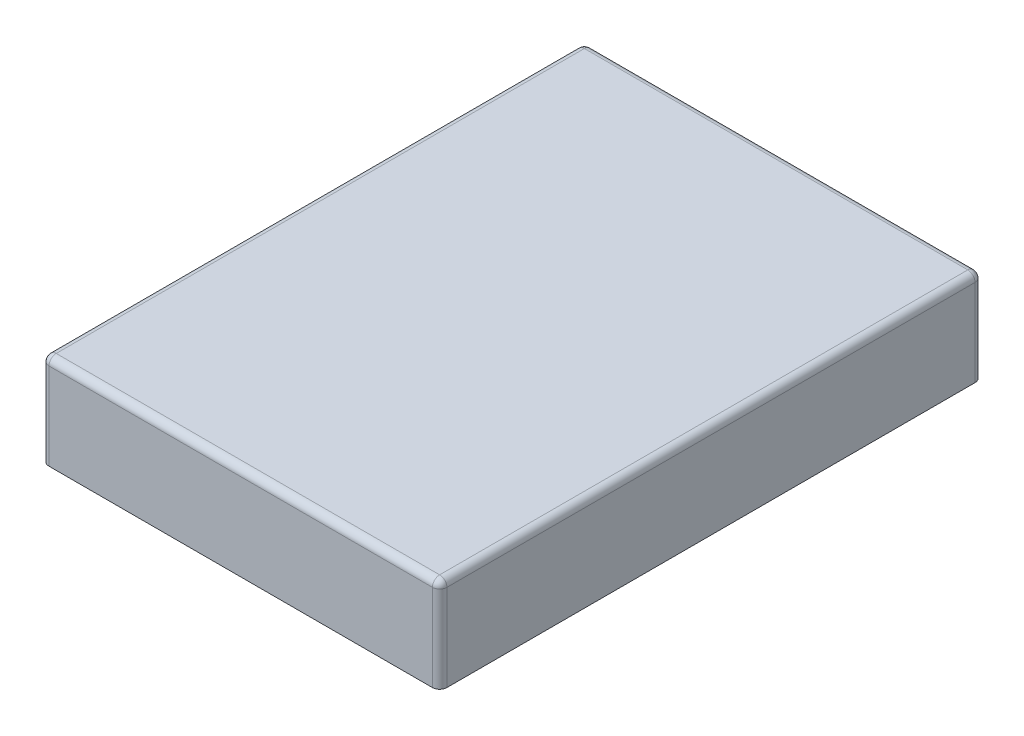
ISO-10303-21;
HEADER;
FILE_DESCRIPTION(('STEP AP214'),'2;1');
FILE_NAME('part.step','',(''),(''),'','','');
FILE_SCHEMA(('AUTOMOTIVE_DESIGN { 1 0 10303 214 1 1 1 1 }'));
ENDSEC;
DATA;
#1=APPLICATION_CONTEXT('core data for automotive mechanical design processes');
#2=APPLICATION_PROTOCOL_DEFINITION('international standard','automotive_design',2000,#1);
#3=PRODUCT_CONTEXT('',#1,'mechanical');
#4=PRODUCT('Part','Part','',(#3));
#5=PRODUCT_RELATED_PRODUCT_CATEGORY('part','',(#4));
#6=PRODUCT_DEFINITION_FORMATION('','',#4);
#7=PRODUCT_DEFINITION_CONTEXT('part definition',#1,'design');
#8=PRODUCT_DEFINITION('design','',#6,#7);
#9=PRODUCT_DEFINITION_SHAPE('','',#8);
#10=(LENGTH_UNIT() NAMED_UNIT(*) SI_UNIT(.MILLI.,.METRE.));
#11=(NAMED_UNIT(*) PLANE_ANGLE_UNIT() SI_UNIT($,.RADIAN.));
#12=(NAMED_UNIT(*) SI_UNIT($,.STERADIAN.) SOLID_ANGLE_UNIT());
#13=UNCERTAINTY_MEASURE_WITH_UNIT(LENGTH_MEASURE(1.E-05),#10,'distance_accuracy_value','');
#14=(GEOMETRIC_REPRESENTATION_CONTEXT(3) GLOBAL_UNCERTAINTY_ASSIGNED_CONTEXT((#13)) GLOBAL_UNIT_ASSIGNED_CONTEXT((#10,
#11,#12)) REPRESENTATION_CONTEXT('',''));
#15=CARTESIAN_POINT('',(0.,0.,0.));
#16=DIRECTION('',(0.,0.,1.));
#17=DIRECTION('',(1.,0.,0.));
#18=AXIS2_PLACEMENT_3D('',#15,#16,#17);
#19=CARTESIAN_POINT('',(27.5,13.,37.5));
#20=DIRECTION('',(-1.,0.,0.));
#21=DIRECTION('',(0.,0.,1.));
#22=AXIS2_PLACEMENT_3D('',#19,#20,#21);
#23=PLANE('',#22);
#24=DIRECTION('',(0.,0.,-1.));
#25=VECTOR('',#24,1.);
#26=CARTESIAN_POINT('',(27.5,0.,37.5));
#27=LINE('',#26,#25);
#28=CARTESIAN_POINT('',(27.5,0.,36.5));
#29=VERTEX_POINT('',#28);
#30=CARTESIAN_POINT('',(27.5,0.,-36.5));
#31=VERTEX_POINT('',#30);
#32=EDGE_CURVE('E209',#29,#31,#27,.T.);
#33=ORIENTED_EDGE('',*,*,#32,.T.);
#34=DIRECTION('',(0.,-1.,0.));
#35=VECTOR('',#34,1.);
#36=CARTESIAN_POINT('',(27.5,13.,-36.5));
#37=LINE('',#36,#35);
#38=CARTESIAN_POINT('',(27.5,12.,-36.5));
#39=VERTEX_POINT('',#38);
#40=EDGE_CURVE('E171',#31,#39,#37,.F.);
#41=ORIENTED_EDGE('',*,*,#40,.T.);
#42=DIRECTION('',(0.,0.,-1.));
#43=VECTOR('',#42,1.);
#44=CARTESIAN_POINT('',(27.5,12.,37.5));
#45=LINE('',#44,#43);
#46=CARTESIAN_POINT('',(27.5,12.,36.5));
#47=VERTEX_POINT('',#46);
#48=EDGE_CURVE('E167',#39,#47,#45,.F.);
#49=ORIENTED_EDGE('',*,*,#48,.T.);
#50=DIRECTION('',(0.,-1.,0.));
#51=VECTOR('',#50,1.);
#52=CARTESIAN_POINT('',(27.5,13.,36.5));
#53=LINE('',#52,#51);
#54=EDGE_CURVE('E169',#47,#29,#53,.T.);
#55=ORIENTED_EDGE('',*,*,#54,.T.);
#56=EDGE_LOOP('',(#33,#41,#49,#55));
#57=FACE_BOUND('',#56,.T.);
#58=ADVANCED_FACE('F39',(#57),#23,.F.);
#59=CARTESIAN_POINT('',(-27.5,13.,-37.5));
#60=DIRECTION('',(0.,0.,1.));
#61=DIRECTION('',(1.,0.,0.));
#62=AXIS2_PLACEMENT_3D('',#59,#60,#61);
#63=PLANE('',#62);
#64=DIRECTION('',(-1.,0.,0.));
#65=VECTOR('',#64,1.);
#66=CARTESIAN_POINT('',(-27.5,0.,-37.5));
#67=LINE('',#66,#65);
#68=CARTESIAN_POINT('',(26.5,0.,-37.5));
#69=VERTEX_POINT('',#68);
#70=CARTESIAN_POINT('',(-26.5,0.,-37.5));
#71=VERTEX_POINT('',#70);
#72=EDGE_CURVE('E148',#69,#71,#67,.T.);
#73=ORIENTED_EDGE('',*,*,#72,.T.);
#74=DIRECTION('',(0.,-1.,0.));
#75=VECTOR('',#74,1.);
#76=CARTESIAN_POINT('',(-26.5,13.,-37.5));
#77=LINE('',#76,#75);
#78=CARTESIAN_POINT('',(-26.5,12.,-37.5));
#79=VERTEX_POINT('',#78);
#80=EDGE_CURVE('E165',#71,#79,#77,.F.);
#81=ORIENTED_EDGE('',*,*,#80,.T.);
#82=DIRECTION('',(-1.,0.,0.));
#83=VECTOR('',#82,1.);
#84=CARTESIAN_POINT('',(-27.5,12.,-37.5));
#85=LINE('',#84,#83);
#86=CARTESIAN_POINT('',(26.5,12.,-37.5));
#87=VERTEX_POINT('',#86);
#88=EDGE_CURVE('E161',#79,#87,#85,.F.);
#89=ORIENTED_EDGE('',*,*,#88,.T.);
#90=DIRECTION('',(0.,-1.,0.));
#91=VECTOR('',#90,1.);
#92=CARTESIAN_POINT('',(26.5,13.,-37.5));
#93=LINE('',#92,#91);
#94=EDGE_CURVE('E163',#87,#69,#93,.T.);
#95=ORIENTED_EDGE('',*,*,#94,.T.);
#96=EDGE_LOOP('',(#73,#81,#89,#95));
#97=FACE_BOUND('',#96,.T.);
#98=ADVANCED_FACE('F221',(#97),#63,.F.);
#99=CARTESIAN_POINT('',(-27.5,13.,37.5));
#100=DIRECTION('',(1.,0.,0.));
#101=DIRECTION('',(0.,0.,-1.));
#102=AXIS2_PLACEMENT_3D('',#99,#100,#101);
#103=PLANE('',#102);
#104=DIRECTION('',(0.,0.,1.));
#105=VECTOR('',#104,1.);
#106=CARTESIAN_POINT('',(-27.5,0.,37.5));
#107=LINE('',#106,#105);
#108=CARTESIAN_POINT('',(-27.5,0.,-36.5));
#109=VERTEX_POINT('',#108);
#110=CARTESIAN_POINT('',(-27.5,0.,36.5));
#111=VERTEX_POINT('',#110);
#112=EDGE_CURVE('E145',#109,#111,#107,.T.);
#113=ORIENTED_EDGE('',*,*,#112,.T.);
#114=DIRECTION('',(0.,-1.,0.));
#115=VECTOR('',#114,1.);
#116=CARTESIAN_POINT('',(-27.5,13.,36.5));
#117=LINE('',#116,#115);
#118=CARTESIAN_POINT('',(-27.5,12.,36.5));
#119=VERTEX_POINT('',#118);
#120=EDGE_CURVE('E124',#111,#119,#117,.F.);
#121=ORIENTED_EDGE('',*,*,#120,.T.);
#122=DIRECTION('',(0.,0.,1.));
#123=VECTOR('',#122,1.);
#124=CARTESIAN_POINT('',(-27.5,12.,37.5));
#125=LINE('',#124,#123);
#126=CARTESIAN_POINT('',(-27.5,12.,-36.5));
#127=VERTEX_POINT('',#126);
#128=EDGE_CURVE('E129',#119,#127,#125,.F.);
#129=ORIENTED_EDGE('',*,*,#128,.T.);
#130=DIRECTION('',(0.,-1.,0.));
#131=VECTOR('',#130,1.);
#132=CARTESIAN_POINT('',(-27.5,13.,-36.5));
#133=LINE('',#132,#131);
#134=EDGE_CURVE('E158',#127,#109,#133,.T.);
#135=ORIENTED_EDGE('',*,*,#134,.T.);
#136=EDGE_LOOP('',(#113,#121,#129,#135));
#137=FACE_BOUND('',#136,.T.);
#138=ADVANCED_FACE('F251',(#137),#103,.F.);
#139=CARTESIAN_POINT('',(-27.5,13.,37.5));
#140=DIRECTION('',(0.,0.,-1.));
#141=DIRECTION('',(-1.,0.,0.));
#142=AXIS2_PLACEMENT_3D('',#139,#140,#141);
#143=PLANE('',#142);
#144=DIRECTION('',(1.,0.,0.));
#145=VECTOR('',#144,1.);
#146=CARTESIAN_POINT('',(-27.5,12.,37.5));
#147=LINE('',#146,#145);
#148=CARTESIAN_POINT('',(26.5,12.,37.5));
#149=VERTEX_POINT('',#148);
#150=CARTESIAN_POINT('',(-26.5,12.,37.5));
#151=VERTEX_POINT('',#150);
#152=EDGE_CURVE('E138',#149,#151,#147,.F.);
#153=ORIENTED_EDGE('',*,*,#152,.T.);
#154=DIRECTION('',(0.,-1.,0.));
#155=VECTOR('',#154,1.);
#156=CARTESIAN_POINT('',(-26.5,13.,37.5));
#157=LINE('',#156,#155);
#158=CARTESIAN_POINT('',(-26.5,0.,37.5));
#159=VERTEX_POINT('',#158);
#160=EDGE_CURVE('E123',#151,#159,#157,.T.);
#161=ORIENTED_EDGE('',*,*,#160,.T.);
#162=DIRECTION('',(1.,0.,0.));
#163=VECTOR('',#162,1.);
#164=CARTESIAN_POINT('',(-27.5,0.,37.5));
#165=LINE('',#164,#163);
#166=CARTESIAN_POINT('',(26.5,0.,37.5));
#167=VERTEX_POINT('',#166);
#168=EDGE_CURVE('E135',#159,#167,#165,.T.);
#169=ORIENTED_EDGE('',*,*,#168,.T.);
#170=DIRECTION('',(0.,-1.,0.));
#171=VECTOR('',#170,1.);
#172=CARTESIAN_POINT('',(26.5,13.,37.5));
#173=LINE('',#172,#171);
#174=EDGE_CURVE('E140',#167,#149,#173,.F.);
#175=ORIENTED_EDGE('',*,*,#174,.T.);
#176=EDGE_LOOP('',(#153,#161,#169,#175));
#177=FACE_BOUND('',#176,.T.);
#178=ADVANCED_FACE('F134',(#177),#143,.F.);
#179=CARTESIAN_POINT('',(0.,13.,0.));
#180=DIRECTION('',(0.,-1.,0.));
#181=DIRECTION('',(0.,0.,-1.));
#182=AXIS2_PLACEMENT_3D('',#179,#180,#181);
#183=PLANE('',#182);
#184=DIRECTION('',(-1.,0.,0.));
#185=VECTOR('',#184,1.);
#186=CARTESIAN_POINT('',(0.,13.,-36.5));
#187=LINE('',#186,#185);
#188=CARTESIAN_POINT('',(26.5,13.,-36.5));
#189=VERTEX_POINT('',#188);
#190=CARTESIAN_POINT('',(-26.5,13.,-36.5));
#191=VERTEX_POINT('',#190);
#192=EDGE_CURVE('E48',#189,#191,#187,.T.);
#193=ORIENTED_EDGE('',*,*,#192,.T.);
#194=DIRECTION('',(0.,0.,1.));
#195=VECTOR('',#194,1.);
#196=CARTESIAN_POINT('',(-26.5,13.,0.));
#197=LINE('',#196,#195);
#198=CARTESIAN_POINT('',(-26.5,13.,36.5));
#199=VERTEX_POINT('',#198);
#200=EDGE_CURVE('E11',#191,#199,#197,.T.);
#201=ORIENTED_EDGE('',*,*,#200,.T.);
#202=DIRECTION('',(1.,0.,0.));
#203=VECTOR('',#202,1.);
#204=CARTESIAN_POINT('',(0.,13.,36.5));
#205=LINE('',#204,#203);
#206=CARTESIAN_POINT('',(26.5,13.,36.5));
#207=VERTEX_POINT('',#206);
#208=EDGE_CURVE('E175',#199,#207,#205,.T.);
#209=ORIENTED_EDGE('',*,*,#208,.T.);
#210=DIRECTION('',(0.,0.,-1.));
#211=VECTOR('',#210,1.);
#212=CARTESIAN_POINT('',(26.5,13.,0.));
#213=LINE('',#212,#211);
#214=EDGE_CURVE('E173',#207,#189,#213,.T.);
#215=ORIENTED_EDGE('',*,*,#214,.T.);
#216=EDGE_LOOP('',(#193,#201,#209,#215));
#217=FACE_BOUND('',#216,.T.);
#218=ADVANCED_FACE('F258',(#217),#183,.F.);
#219=CARTESIAN_POINT('',(0.,0.,0.));
#220=DIRECTION('',(0.,-1.,0.));
#221=DIRECTION('',(0.,0.,-1.));
#222=AXIS2_PLACEMENT_3D('',#219,#220,#221);
#223=PLANE('',#222);
#224=ORIENTED_EDGE('',*,*,#168,.F.);
#225=CARTESIAN_POINT('',(-26.5,0.,36.5));
#226=DIRECTION('',(0.,-1.,0.));
#227=DIRECTION('',(0.,0.,-1.));
#228=AXIS2_PLACEMENT_3D('',#225,#226,#227);
#229=CIRCLE('',#228,1.);
#230=EDGE_CURVE('E119',#159,#111,#229,.T.);
#231=ORIENTED_EDGE('',*,*,#230,.T.);
#232=ORIENTED_EDGE('',*,*,#112,.F.);
#233=CARTESIAN_POINT('',(-26.5,0.,-36.5));
#234=DIRECTION('',(0.,-1.,0.));
#235=DIRECTION('',(0.,0.,-1.));
#236=AXIS2_PLACEMENT_3D('',#233,#234,#235);
#237=CIRCLE('',#236,1.);
#238=EDGE_CURVE('E130',#109,#71,#237,.T.);
#239=ORIENTED_EDGE('',*,*,#238,.T.);
#240=ORIENTED_EDGE('',*,*,#72,.F.);
#241=CARTESIAN_POINT('',(26.5,0.,-36.5));
#242=DIRECTION('',(0.,-1.,0.));
#243=DIRECTION('',(0.,0.,-1.));
#244=AXIS2_PLACEMENT_3D('',#241,#242,#243);
#245=CIRCLE('',#244,1.);
#246=EDGE_CURVE('E154',#69,#31,#245,.T.);
#247=ORIENTED_EDGE('',*,*,#246,.T.);
#248=ORIENTED_EDGE('',*,*,#32,.F.);
#249=CARTESIAN_POINT('',(26.5,0.,36.5));
#250=DIRECTION('',(0.,-1.,0.));
#251=DIRECTION('',(0.,0.,-1.));
#252=AXIS2_PLACEMENT_3D('',#249,#250,#251);
#253=CIRCLE('',#252,1.);
#254=EDGE_CURVE('E139',#29,#167,#253,.T.);
#255=ORIENTED_EDGE('',*,*,#254,.T.);
#256=EDGE_LOOP('',(#224,#231,#232,#239,#240,#247,#248,#255));
#257=FACE_BOUND('',#256,.T.);
#258=ADVANCED_FACE('F142',(#257),#223,.T.);
#259=CARTESIAN_POINT('',(26.5,13.,-36.5));
#260=DIRECTION('',(0.,-1.,0.));
#261=DIRECTION('',(0.,0.,-1.));
#262=AXIS2_PLACEMENT_3D('',#259,#260,#261);
#263=CYLINDRICAL_SURFACE('',#262,1.);
#264=CARTESIAN_POINT('',(26.5,12.,-36.5));
#265=DIRECTION('',(0.,1.,0.));
#266=DIRECTION('',(0.,0.,1.));
#267=AXIS2_PLACEMENT_3D('',#264,#265,#266);
#268=CIRCLE('',#267,1.);
#269=EDGE_CURVE('E43',#39,#87,#268,.T.);
#270=ORIENTED_EDGE('',*,*,#269,.F.);
#271=ORIENTED_EDGE('',*,*,#40,.F.);
#272=ORIENTED_EDGE('',*,*,#246,.F.);
#273=ORIENTED_EDGE('',*,*,#94,.F.);
#274=EDGE_LOOP('',(#270,#271,#272,#273));
#275=FACE_BOUND('',#274,.T.);
#276=ADVANCED_FACE('F41',(#275),#263,.T.);
#277=CARTESIAN_POINT('',(26.5,12.,-36.5));
#278=DIRECTION('',(0.,0.,-1.));
#279=DIRECTION('',(-1.,0.,0.));
#280=AXIS2_PLACEMENT_3D('',#277,#278,#279);
#281=SPHERICAL_SURFACE('',#280,1.);
#282=CARTESIAN_POINT('',(26.5,12.,-36.5));
#283=DIRECTION('',(0.,0.,-1.));
#284=DIRECTION('',(-1.,0.,0.));
#285=AXIS2_PLACEMENT_3D('',#282,#283,#284);
#286=CIRCLE('',#285,1.);
#287=EDGE_CURVE('E201',#39,#189,#286,.F.);
#288=ORIENTED_EDGE('',*,*,#287,.F.);
#289=ORIENTED_EDGE('',*,*,#269,.T.);
#290=CARTESIAN_POINT('',(26.5,12.,-36.5));
#291=DIRECTION('',(1.,0.,0.));
#292=DIRECTION('',(0.,0.,-1.));
#293=AXIS2_PLACEMENT_3D('',#290,#291,#292);
#294=CIRCLE('',#293,1.);
#295=EDGE_CURVE('E203',#189,#87,#294,.F.);
#296=ORIENTED_EDGE('',*,*,#295,.F.);
#297=EDGE_LOOP('',(#288,#289,#296));
#298=FACE_BOUND('',#297,.T.);
#299=ADVANCED_FACE('F287',(#298),#281,.T.);
#300=CARTESIAN_POINT('',(-26.5,13.,-36.5));
#301=DIRECTION('',(0.,-1.,0.));
#302=DIRECTION('',(0.,0.,-1.));
#303=AXIS2_PLACEMENT_3D('',#300,#301,#302);
#304=CYLINDRICAL_SURFACE('',#303,1.);
#305=ORIENTED_EDGE('',*,*,#238,.F.);
#306=ORIENTED_EDGE('',*,*,#134,.F.);
#307=CARTESIAN_POINT('',(-26.5,12.,-36.5));
#308=DIRECTION('',(0.,1.,0.));
#309=DIRECTION('',(0.,0.,1.));
#310=AXIS2_PLACEMENT_3D('',#307,#308,#309);
#311=CIRCLE('',#310,1.);
#312=EDGE_CURVE('E198',#79,#127,#311,.T.);
#313=ORIENTED_EDGE('',*,*,#312,.F.);
#314=ORIENTED_EDGE('',*,*,#80,.F.);
#315=EDGE_LOOP('',(#305,#306,#313,#314));
#316=FACE_BOUND('',#315,.T.);
#317=ADVANCED_FACE('F227',(#316),#304,.T.);
#318=CARTESIAN_POINT('',(0.,12.,-36.5));
#319=DIRECTION('',(-1.,0.,0.));
#320=DIRECTION('',(0.,0.,1.));
#321=AXIS2_PLACEMENT_3D('',#318,#319,#320);
#322=CYLINDRICAL_SURFACE('',#321,1.);
#323=ORIENTED_EDGE('',*,*,#295,.T.);
#324=ORIENTED_EDGE('',*,*,#88,.F.);
#325=CARTESIAN_POINT('',(-26.5,12.,-36.5));
#326=DIRECTION('',(-1.,0.,0.));
#327=DIRECTION('',(0.,0.,1.));
#328=AXIS2_PLACEMENT_3D('',#325,#326,#327);
#329=CIRCLE('',#328,1.);
#330=EDGE_CURVE('E195',#191,#79,#329,.T.);
#331=ORIENTED_EDGE('',*,*,#330,.F.);
#332=ORIENTED_EDGE('',*,*,#192,.F.);
#333=EDGE_LOOP('',(#323,#324,#331,#332));
#334=FACE_BOUND('',#333,.T.);
#335=ADVANCED_FACE('F233',(#334),#322,.T.);
#336=CARTESIAN_POINT('',(26.5,12.,0.));
#337=DIRECTION('',(0.,0.,-1.));
#338=DIRECTION('',(-1.,0.,0.));
#339=AXIS2_PLACEMENT_3D('',#336,#337,#338);
#340=CYLINDRICAL_SURFACE('',#339,1.);
#341=ORIENTED_EDGE('',*,*,#287,.T.);
#342=ORIENTED_EDGE('',*,*,#214,.F.);
#343=CARTESIAN_POINT('',(26.5,12.,36.5));
#344=DIRECTION('',(0.,0.,1.));
#345=DIRECTION('',(1.,0.,0.));
#346=AXIS2_PLACEMENT_3D('',#343,#344,#345);
#347=CIRCLE('',#346,1.);
#348=EDGE_CURVE('E192',#47,#207,#347,.T.);
#349=ORIENTED_EDGE('',*,*,#348,.F.);
#350=ORIENTED_EDGE('',*,*,#48,.F.);
#351=EDGE_LOOP('',(#341,#342,#349,#350));
#352=FACE_BOUND('',#351,.T.);
#353=ADVANCED_FACE('F280',(#352),#340,.T.);
#354=CARTESIAN_POINT('',(26.5,13.,36.5));
#355=DIRECTION('',(0.,-1.,0.));
#356=DIRECTION('',(0.,0.,-1.));
#357=AXIS2_PLACEMENT_3D('',#354,#355,#356);
#358=CYLINDRICAL_SURFACE('',#357,1.);
#359=ORIENTED_EDGE('',*,*,#254,.F.);
#360=ORIENTED_EDGE('',*,*,#54,.F.);
#361=CARTESIAN_POINT('',(26.5,12.,36.5));
#362=DIRECTION('',(0.,1.,0.));
#363=DIRECTION('',(0.,0.,1.));
#364=AXIS2_PLACEMENT_3D('',#361,#362,#363);
#365=CIRCLE('',#364,1.);
#366=EDGE_CURVE('E189',#149,#47,#365,.T.);
#367=ORIENTED_EDGE('',*,*,#366,.F.);
#368=ORIENTED_EDGE('',*,*,#174,.F.);
#369=EDGE_LOOP('',(#359,#360,#367,#368));
#370=FACE_BOUND('',#369,.T.);
#371=ADVANCED_FACE('F237',(#370),#358,.T.);
#372=CARTESIAN_POINT('',(-26.5,12.,-36.5));
#373=DIRECTION('',(0.,0.,-1.));
#374=DIRECTION('',(-1.,0.,0.));
#375=AXIS2_PLACEMENT_3D('',#372,#373,#374);
#376=SPHERICAL_SURFACE('',#375,1.);
#377=ORIENTED_EDGE('',*,*,#330,.T.);
#378=ORIENTED_EDGE('',*,*,#312,.T.);
#379=CARTESIAN_POINT('',(-26.5,12.,-36.5));
#380=DIRECTION('',(0.,0.,-1.));
#381=DIRECTION('',(0.,1.,0.));
#382=AXIS2_PLACEMENT_3D('',#379,#380,#381);
#383=CIRCLE('',#382,1.);
#384=EDGE_CURVE('E186',#191,#127,#383,.F.);
#385=ORIENTED_EDGE('',*,*,#384,.F.);
#386=EDGE_LOOP('',(#377,#378,#385));
#387=FACE_BOUND('',#386,.T.);
#388=ADVANCED_FACE('F231',(#387),#376,.T.);
#389=CARTESIAN_POINT('',(26.5,12.,36.5));
#390=DIRECTION('',(1.,0.,0.));
#391=DIRECTION('',(0.,0.,-1.));
#392=AXIS2_PLACEMENT_3D('',#389,#390,#391);
#393=SPHERICAL_SURFACE('',#392,1.);
#394=ORIENTED_EDGE('',*,*,#366,.T.);
#395=ORIENTED_EDGE('',*,*,#348,.T.);
#396=CARTESIAN_POINT('',(26.5,12.,36.5));
#397=DIRECTION('',(1.,0.,0.));
#398=DIRECTION('',(0.,0.,-1.));
#399=AXIS2_PLACEMENT_3D('',#396,#397,#398);
#400=CIRCLE('',#399,1.);
#401=EDGE_CURVE('E183',#149,#207,#400,.F.);
#402=ORIENTED_EDGE('',*,*,#401,.F.);
#403=EDGE_LOOP('',(#394,#395,#402));
#404=FACE_BOUND('',#403,.T.);
#405=ADVANCED_FACE('F242',(#404),#393,.T.);
#406=CARTESIAN_POINT('',(-26.5,12.,0.));
#407=DIRECTION('',(0.,0.,1.));
#408=DIRECTION('',(1.,0.,0.));
#409=AXIS2_PLACEMENT_3D('',#406,#407,#408);
#410=CYLINDRICAL_SURFACE('',#409,1.);
#411=ORIENTED_EDGE('',*,*,#384,.T.);
#412=ORIENTED_EDGE('',*,*,#128,.F.);
#413=CARTESIAN_POINT('',(-26.5,12.,36.5));
#414=DIRECTION('',(0.,0.,1.));
#415=DIRECTION('',(1.,0.,0.));
#416=AXIS2_PLACEMENT_3D('',#413,#414,#415);
#417=CIRCLE('',#416,1.);
#418=EDGE_CURVE('E181',#199,#119,#417,.T.);
#419=ORIENTED_EDGE('',*,*,#418,.F.);
#420=ORIENTED_EDGE('',*,*,#200,.F.);
#421=EDGE_LOOP('',(#411,#412,#419,#420));
#422=FACE_BOUND('',#421,.T.);
#423=ADVANCED_FACE('F249',(#422),#410,.T.);
#424=CARTESIAN_POINT('',(0.,12.,36.5));
#425=DIRECTION('',(1.,0.,0.));
#426=DIRECTION('',(0.,0.,-1.));
#427=AXIS2_PLACEMENT_3D('',#424,#425,#426);
#428=CYLINDRICAL_SURFACE('',#427,1.);
#429=ORIENTED_EDGE('',*,*,#401,.T.);
#430=ORIENTED_EDGE('',*,*,#208,.F.);
#431=CARTESIAN_POINT('',(-26.5,12.,36.5));
#432=DIRECTION('',(-1.,0.,0.));
#433=DIRECTION('',(0.,0.,1.));
#434=AXIS2_PLACEMENT_3D('',#431,#432,#433);
#435=CIRCLE('',#434,1.);
#436=EDGE_CURVE('E62',#151,#199,#435,.T.);
#437=ORIENTED_EDGE('',*,*,#436,.F.);
#438=ORIENTED_EDGE('',*,*,#152,.F.);
#439=EDGE_LOOP('',(#429,#430,#437,#438));
#440=FACE_BOUND('',#439,.T.);
#441=ADVANCED_FACE('F245',(#440),#428,.T.);
#442=CARTESIAN_POINT('',(-26.5,12.,36.5));
#443=DIRECTION('',(0.,1.,0.));
#444=DIRECTION('',(0.,0.,1.));
#445=AXIS2_PLACEMENT_3D('',#442,#443,#444);
#446=SPHERICAL_SURFACE('',#445,1.);
#447=ORIENTED_EDGE('',*,*,#436,.T.);
#448=ORIENTED_EDGE('',*,*,#418,.T.);
#449=CARTESIAN_POINT('',(-26.5,12.,36.5));
#450=DIRECTION('',(0.,1.,0.));
#451=DIRECTION('',(0.,0.,1.));
#452=AXIS2_PLACEMENT_3D('',#449,#450,#451);
#453=CIRCLE('',#452,1.);
#454=EDGE_CURVE('E178',#151,#119,#453,.F.);
#455=ORIENTED_EDGE('',*,*,#454,.F.);
#456=EDGE_LOOP('',(#447,#448,#455));
#457=FACE_BOUND('',#456,.T.);
#458=ADVANCED_FACE('F246',(#457),#446,.T.);
#459=CARTESIAN_POINT('',(-26.5,13.,36.5));
#460=DIRECTION('',(0.,-1.,0.));
#461=DIRECTION('',(0.,0.,-1.));
#462=AXIS2_PLACEMENT_3D('',#459,#460,#461);
#463=CYLINDRICAL_SURFACE('',#462,1.);
#464=ORIENTED_EDGE('',*,*,#454,.T.);
#465=ORIENTED_EDGE('',*,*,#120,.F.);
#466=ORIENTED_EDGE('',*,*,#230,.F.);
#467=ORIENTED_EDGE('',*,*,#160,.F.);
#468=EDGE_LOOP('',(#464,#465,#466,#467));
#469=FACE_BOUND('',#468,.T.);
#470=ADVANCED_FACE('F122',(#469),#463,.T.);
#471=CLOSED_SHELL('',(#58,#98,#138,#178,#218,#258,#276,#299,#317,#335,#353,#371,#388,#405,#423,
#441,#458,#470));
#472=MANIFOLD_SOLID_BREP('B2',#471);
#473=ADVANCED_BREP_SHAPE_REPRESENTATION('',(#18,#472),#14);
#474=SHAPE_DEFINITION_REPRESENTATION(#9,#473);
ENDSEC;
END-ISO-10303-21;
